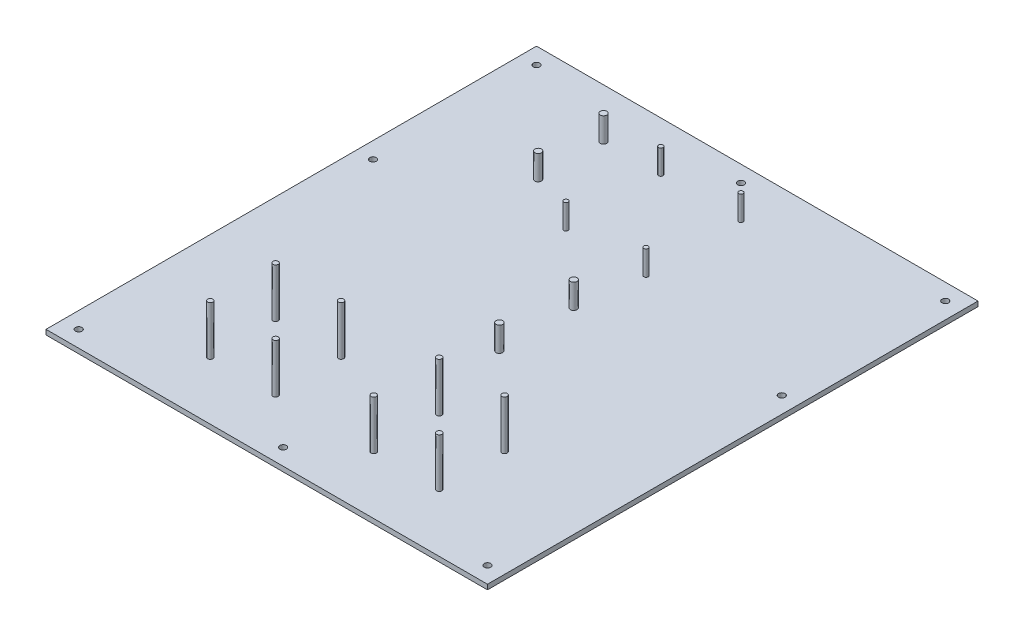
ISO-10303-21;
HEADER;
FILE_DESCRIPTION(('STEP AP214'),'2;1');
FILE_NAME('part.step','',(''),(''),'','','');
FILE_SCHEMA(('AUTOMOTIVE_DESIGN { 1 0 10303 214 1 1 1 1 }'));
ENDSEC;
DATA;
#1=APPLICATION_CONTEXT('core data for automotive mechanical design processes');
#2=APPLICATION_PROTOCOL_DEFINITION('international standard','automotive_design',2000,#1);
#3=PRODUCT_CONTEXT('',#1,'mechanical');
#4=PRODUCT('Part','Part','',(#3));
#5=PRODUCT_RELATED_PRODUCT_CATEGORY('part','',(#4));
#6=PRODUCT_DEFINITION_FORMATION('','',#4);
#7=PRODUCT_DEFINITION_CONTEXT('part definition',#1,'design');
#8=PRODUCT_DEFINITION('design','',#6,#7);
#9=PRODUCT_DEFINITION_SHAPE('','',#8);
#10=(LENGTH_UNIT() NAMED_UNIT(*) SI_UNIT(.MILLI.,.METRE.));
#11=(NAMED_UNIT(*) PLANE_ANGLE_UNIT() SI_UNIT($,.RADIAN.));
#12=(NAMED_UNIT(*) SI_UNIT($,.STERADIAN.) SOLID_ANGLE_UNIT());
#13=UNCERTAINTY_MEASURE_WITH_UNIT(LENGTH_MEASURE(1.E-05),#10,'distance_accuracy_value','');
#14=(GEOMETRIC_REPRESENTATION_CONTEXT(3) GLOBAL_UNCERTAINTY_ASSIGNED_CONTEXT((#13)) GLOBAL_UNIT_ASSIGNED_CONTEXT((#10,
#11,#12)) REPRESENTATION_CONTEXT('',''));
#15=CARTESIAN_POINT('',(0.,0.,0.));
#16=DIRECTION('',(0.,0.,1.));
#17=DIRECTION('',(1.,0.,0.));
#18=AXIS2_PLACEMENT_3D('',#15,#16,#17);
#19=CARTESIAN_POINT('',(0.,3.,0.));
#20=DIRECTION('',(0.,-1.,0.));
#21=DIRECTION('',(0.,0.,-1.));
#22=AXIS2_PLACEMENT_3D('',#19,#20,#21);
#23=PLANE('',#22);
#24=CARTESIAN_POINT('',(155.,3.,-212.));
#25=DIRECTION('',(0.,1.,0.));
#26=DIRECTION('',(0.,0.,1.));
#27=AXIS2_PLACEMENT_3D('',#24,#25,#26);
#28=CIRCLE('',#27,1.34999999999998);
#29=CARTESIAN_POINT('',(155.,3.,-210.65));
#30=VERTEX_POINT('',#29);
#31=EDGE_CURVE('E430',#30,#30,#28,.T.);
#32=ORIENTED_EDGE('',*,*,#31,.F.);
#33=EDGE_LOOP('',(#32));
#34=FACE_BOUND('',#33,.T.);
#35=CARTESIAN_POINT('',(106.,3.,-212.));
#36=DIRECTION('',(0.,1.,0.));
#37=DIRECTION('',(0.,0.,1.));
#38=AXIS2_PLACEMENT_3D('',#35,#36,#37);
#39=CIRCLE('',#38,1.35);
#40=CARTESIAN_POINT('',(106.,3.,-210.65));
#41=VERTEX_POINT('',#40);
#42=EDGE_CURVE('E422',#41,#41,#39,.T.);
#43=ORIENTED_EDGE('',*,*,#42,.F.);
#44=EDGE_LOOP('',(#43));
#45=FACE_BOUND('',#44,.T.);
#46=CARTESIAN_POINT('',(155.,3.,-270.));
#47=DIRECTION('',(0.,1.,0.));
#48=DIRECTION('',(0.,0.,1.));
#49=AXIS2_PLACEMENT_3D('',#46,#47,#48);
#50=CIRCLE('',#49,1.34999999999998);
#51=CARTESIAN_POINT('',(155.,3.,-268.65));
#52=VERTEX_POINT('',#51);
#53=EDGE_CURVE('E414',#52,#52,#50,.T.);
#54=ORIENTED_EDGE('',*,*,#53,.F.);
#55=EDGE_LOOP('',(#54));
#56=FACE_BOUND('',#55,.T.);
#57=CARTESIAN_POINT('',(106.,3.,-270.));
#58=DIRECTION('',(0.,1.,0.));
#59=DIRECTION('',(0.,0.,1.));
#60=AXIS2_PLACEMENT_3D('',#57,#58,#59);
#61=CIRCLE('',#60,1.35);
#62=CARTESIAN_POINT('',(106.,3.,-268.65));
#63=VERTEX_POINT('',#62);
#64=EDGE_CURVE('E409',#63,#63,#61,.T.);
#65=ORIENTED_EDGE('',*,*,#64,.F.);
#66=EDGE_LOOP('',(#65));
#67=FACE_BOUND('',#66,.T.);
#68=CARTESIAN_POINT('',(205.,3.,-35.462075723532));
#69=DIRECTION('',(0.,1.,0.));
#70=DIRECTION('',(0.,0.,1.));
#71=AXIS2_PLACEMENT_3D('',#68,#69,#70);
#72=CIRCLE('',#71,1.59999999999999);
#73=CARTESIAN_POINT('',(205.,3.,-33.8620757235321));
#74=VERTEX_POINT('',#73);
#75=EDGE_CURVE('E373',#74,#74,#72,.T.);
#76=ORIENTED_EDGE('',*,*,#75,.F.);
#77=EDGE_LOOP('',(#76));
#78=FACE_BOUND('',#77,.T.);
#79=CARTESIAN_POINT('',(205.,3.,-75.4620757235321));
#80=DIRECTION('',(0.,1.,0.));
#81=DIRECTION('',(0.,0.,1.));
#82=AXIS2_PLACEMENT_3D('',#79,#80,#81);
#83=CIRCLE('',#82,1.59999999999999);
#84=CARTESIAN_POINT('',(205.,3.,-73.8620757235321));
#85=VERTEX_POINT('',#84);
#86=EDGE_CURVE('E369',#85,#85,#83,.T.);
#87=ORIENTED_EDGE('',*,*,#86,.F.);
#88=EDGE_LOOP('',(#87));
#89=FACE_BOUND('',#88,.T.);
#90=CARTESIAN_POINT('',(71.,3.,-230.));
#91=DIRECTION('',(0.,-1.,0.));
#92=DIRECTION('',(0.,0.,-1.));
#93=AXIS2_PLACEMENT_3D('',#90,#91,#92);
#94=CIRCLE('',#93,2.);
#95=CARTESIAN_POINT('',(71.,3.,-232.));
#96=VERTEX_POINT('',#95);
#97=EDGE_CURVE('E11',#96,#96,#94,.F.);
#98=ORIENTED_EDGE('',*,*,#97,.F.);
#99=EDGE_LOOP('',(#98));
#100=FACE_BOUND('',#99,.T.);
#101=CARTESIAN_POINT('',(165.,3.,-75.4620757235321));
#102=DIRECTION('',(0.,-1.,0.));
#103=DIRECTION('',(0.,0.,-1.));
#104=AXIS2_PLACEMENT_3D('',#101,#102,#103);
#105=CIRCLE('',#104,1.59999999999999);
#106=CARTESIAN_POINT('',(165.,3.,-77.062075723532));
#107=VERTEX_POINT('',#106);
#108=EDGE_CURVE('E49',#107,#107,#105,.F.);
#109=ORIENTED_EDGE('',*,*,#108,.F.);
#110=EDGE_LOOP('',(#109));
#111=FACE_BOUND('',#110,.T.);
#112=CARTESIAN_POINT('',(105.,3.,-35.462075723532));
#113=DIRECTION('',(0.,-1.,0.));
#114=DIRECTION('',(0.,0.,-1.));
#115=AXIS2_PLACEMENT_3D('',#112,#113,#114);
#116=CIRCLE('',#115,1.60000000000001);
#117=CARTESIAN_POINT('',(105.,3.,-37.062075723532));
#118=VERTEX_POINT('',#117);
#119=EDGE_CURVE('E157',#118,#118,#116,.F.);
#120=ORIENTED_EDGE('',*,*,#119,.F.);
#121=EDGE_LOOP('',(#120));
#122=FACE_BOUND('',#121,.T.);
#123=CARTESIAN_POINT('',(65.,3.,-35.462075723532));
#124=DIRECTION('',(0.,-1.,0.));
#125=DIRECTION('',(0.,0.,-1.));
#126=AXIS2_PLACEMENT_3D('',#123,#124,#125);
#127=CIRCLE('',#126,1.60000000000001);
#128=CARTESIAN_POINT('',(65.,3.,-37.062075723532));
#129=VERTEX_POINT('',#128);
#130=EDGE_CURVE('E153',#129,#129,#127,.F.);
#131=ORIENTED_EDGE('',*,*,#130,.F.);
#132=EDGE_LOOP('',(#131));
#133=FACE_BOUND('',#132,.T.);
#134=CARTESIAN_POINT('',(105.,3.,-75.4620757235321));
#135=DIRECTION('',(0.,-1.,0.));
#136=DIRECTION('',(0.,0.,-1.));
#137=AXIS2_PLACEMENT_3D('',#134,#135,#136);
#138=CIRCLE('',#137,1.60000000000001);
#139=CARTESIAN_POINT('',(105.,3.,-77.0620757235321));
#140=VERTEX_POINT('',#139);
#141=EDGE_CURVE('E149',#140,#140,#138,.F.);
#142=ORIENTED_EDGE('',*,*,#141,.F.);
#143=EDGE_LOOP('',(#142));
#144=FACE_BOUND('',#143,.T.);
#145=CARTESIAN_POINT('',(65.,3.,-75.4620757235321));
#146=DIRECTION('',(0.,-1.,0.));
#147=DIRECTION('',(0.,0.,-1.));
#148=AXIS2_PLACEMENT_3D('',#145,#146,#147);
#149=CIRCLE('',#148,1.60000000000001);
#150=CARTESIAN_POINT('',(65.,3.,-77.0620757235321));
#151=VERTEX_POINT('',#150);
#152=EDGE_CURVE('E145',#151,#151,#149,.F.);
#153=ORIENTED_EDGE('',*,*,#152,.F.);
#154=EDGE_LOOP('',(#153));
#155=FACE_BOUND('',#154,.T.);
#156=CARTESIAN_POINT('',(165.,3.,-35.462075723532));
#157=DIRECTION('',(0.,-1.,0.));
#158=DIRECTION('',(0.,0.,-1.));
#159=AXIS2_PLACEMENT_3D('',#156,#157,#158);
#160=CIRCLE('',#159,1.59999999999999);
#161=CARTESIAN_POINT('',(165.,3.,-37.062075723532));
#162=VERTEX_POINT('',#161);
#163=EDGE_CURVE('E141',#162,#162,#160,.F.);
#164=ORIENTED_EDGE('',*,*,#163,.F.);
#165=EDGE_LOOP('',(#164));
#166=FACE_BOUND('',#165,.T.);
#167=CARTESIAN_POINT('',(71.,3.,-270.));
#168=DIRECTION('',(0.,-1.,0.));
#169=DIRECTION('',(0.,0.,-1.));
#170=AXIS2_PLACEMENT_3D('',#167,#168,#169);
#171=CIRCLE('',#170,2.);
#172=CARTESIAN_POINT('',(71.,3.,-272.));
#173=VERTEX_POINT('',#172);
#174=EDGE_CURVE('E137',#173,#173,#171,.F.);
#175=ORIENTED_EDGE('',*,*,#174,.F.);
#176=EDGE_LOOP('',(#175));
#177=FACE_BOUND('',#176,.T.);
#178=CARTESIAN_POINT('',(150.,3.,-127.25));
#179=DIRECTION('',(0.,-1.,0.));
#180=DIRECTION('',(0.,0.,-1.));
#181=AXIS2_PLACEMENT_3D('',#178,#179,#180);
#182=CIRCLE('',#181,2.);
#183=CARTESIAN_POINT('',(150.,3.,-129.25));
#184=VERTEX_POINT('',#183);
#185=EDGE_CURVE('E133',#184,#184,#182,.F.);
#186=ORIENTED_EDGE('',*,*,#185,.F.);
#187=EDGE_LOOP('',(#186));
#188=FACE_BOUND('',#187,.T.);
#189=CARTESIAN_POINT('',(150.,3.,-172.75));
#190=DIRECTION('',(0.,-1.,0.));
#191=DIRECTION('',(0.,0.,-1.));
#192=AXIS2_PLACEMENT_3D('',#189,#190,#191);
#193=CIRCLE('',#192,2.);
#194=CARTESIAN_POINT('',(150.,3.,-174.75));
#195=VERTEX_POINT('',#194);
#196=EDGE_CURVE('E129',#195,#195,#193,.F.);
#197=ORIENTED_EDGE('',*,*,#196,.F.);
#198=EDGE_LOOP('',(#197));
#199=FACE_BOUND('',#198,.T.);
#200=DIRECTION('',(0.,0.,1.));
#201=VECTOR('',#200,1.);
#202=CARTESIAN_POINT('',(0.,3.,0.));
#203=LINE('',#202,#201);
#204=CARTESIAN_POINT('',(0.,3.,-300.));
#205=VERTEX_POINT('',#204);
#206=CARTESIAN_POINT('',(0.,3.,0.));
#207=VERTEX_POINT('',#206);
#208=EDGE_CURVE('E93',#205,#207,#203,.T.);
#209=ORIENTED_EDGE('',*,*,#208,.T.);
#210=DIRECTION('',(1.,0.,0.));
#211=VECTOR('',#210,1.);
#212=CARTESIAN_POINT('',(0.,3.,0.));
#213=LINE('',#212,#211);
#214=CARTESIAN_POINT('',(270.,3.,0.));
#215=VERTEX_POINT('',#214);
#216=EDGE_CURVE('E88',#207,#215,#213,.T.);
#217=ORIENTED_EDGE('',*,*,#216,.T.);
#218=DIRECTION('',(0.,0.,-1.));
#219=VECTOR('',#218,1.);
#220=CARTESIAN_POINT('',(270.,3.,0.));
#221=LINE('',#220,#219);
#222=CARTESIAN_POINT('',(270.,3.,-300.));
#223=VERTEX_POINT('',#222);
#224=EDGE_CURVE('E91',#215,#223,#221,.T.);
#225=ORIENTED_EDGE('',*,*,#224,.T.);
#226=DIRECTION('',(-1.,0.,0.));
#227=VECTOR('',#226,1.);
#228=CARTESIAN_POINT('',(0.,3.,-300.));
#229=LINE('',#228,#227);
#230=EDGE_CURVE('E57',#223,#205,#229,.T.);
#231=ORIENTED_EDGE('',*,*,#230,.T.);
#232=EDGE_LOOP('',(#209,#217,#225,#231));
#233=FACE_BOUND('',#232,.T.);
#234=CARTESIAN_POINT('',(135.,3.,-10.));
#235=DIRECTION('',(0.,1.,0.));
#236=DIRECTION('',(0.,0.,1.));
#237=AXIS2_PLACEMENT_3D('',#234,#235,#236);
#238=CIRCLE('',#237,2.);
#239=CARTESIAN_POINT('',(135.,3.,-8.));
#240=VERTEX_POINT('',#239);
#241=EDGE_CURVE('E116',#240,#240,#238,.T.);
#242=ORIENTED_EDGE('',*,*,#241,.F.);
#243=EDGE_LOOP('',(#242));
#244=FACE_BOUND('',#243,.T.);
#245=CARTESIAN_POINT('',(10.,3.,-290.));
#246=DIRECTION('',(0.,1.,0.));
#247=DIRECTION('',(0.,0.,1.));
#248=AXIS2_PLACEMENT_3D('',#245,#246,#247);
#249=CIRCLE('',#248,2.);
#250=CARTESIAN_POINT('',(10.,3.,-288.));
#251=VERTEX_POINT('',#250);
#252=EDGE_CURVE('E315',#251,#251,#249,.T.);
#253=ORIENTED_EDGE('',*,*,#252,.F.);
#254=EDGE_LOOP('',(#253));
#255=FACE_BOUND('',#254,.T.);
#256=CARTESIAN_POINT('',(10.,3.,-190.));
#257=DIRECTION('',(0.,1.,0.));
#258=DIRECTION('',(0.,0.,1.));
#259=AXIS2_PLACEMENT_3D('',#256,#257,#258);
#260=CIRCLE('',#259,2.);
#261=CARTESIAN_POINT('',(10.,3.,-188.));
#262=VERTEX_POINT('',#261);
#263=EDGE_CURVE('E308',#262,#262,#260,.T.);
#264=ORIENTED_EDGE('',*,*,#263,.F.);
#265=EDGE_LOOP('',(#264));
#266=FACE_BOUND('',#265,.T.);
#267=CARTESIAN_POINT('',(10.,3.,-9.99999999999998));
#268=DIRECTION('',(0.,1.,0.));
#269=DIRECTION('',(0.,0.,1.));
#270=AXIS2_PLACEMENT_3D('',#267,#268,#269);
#271=CIRCLE('',#270,2.);
#272=CARTESIAN_POINT('',(10.,3.,-7.99999999999998));
#273=VERTEX_POINT('',#272);
#274=EDGE_CURVE('E301',#273,#273,#271,.T.);
#275=ORIENTED_EDGE('',*,*,#274,.F.);
#276=EDGE_LOOP('',(#275));
#277=FACE_BOUND('',#276,.T.);
#278=CARTESIAN_POINT('',(260.,3.,-290.));
#279=DIRECTION('',(0.,1.,0.));
#280=DIRECTION('',(0.,0.,-1.));
#281=AXIS2_PLACEMENT_3D('',#278,#279,#280);
#282=CIRCLE('',#281,2.);
#283=CARTESIAN_POINT('',(260.,3.,-292.));
#284=VERTEX_POINT('',#283);
#285=EDGE_CURVE('E294',#284,#284,#282,.T.);
#286=ORIENTED_EDGE('',*,*,#285,.F.);
#287=EDGE_LOOP('',(#286));
#288=FACE_BOUND('',#287,.T.);
#289=CARTESIAN_POINT('',(260.,3.,-190.));
#290=DIRECTION('',(0.,1.,0.));
#291=DIRECTION('',(0.,0.,-1.));
#292=AXIS2_PLACEMENT_3D('',#289,#290,#291);
#293=CIRCLE('',#292,2.);
#294=CARTESIAN_POINT('',(260.,3.,-192.));
#295=VERTEX_POINT('',#294);
#296=EDGE_CURVE('E287',#295,#295,#293,.T.);
#297=ORIENTED_EDGE('',*,*,#296,.F.);
#298=EDGE_LOOP('',(#297));
#299=FACE_BOUND('',#298,.T.);
#300=CARTESIAN_POINT('',(260.,3.,-9.99999999999998));
#301=DIRECTION('',(0.,1.,0.));
#302=DIRECTION('',(0.,0.,-1.));
#303=AXIS2_PLACEMENT_3D('',#300,#301,#302);
#304=CIRCLE('',#303,2.);
#305=CARTESIAN_POINT('',(260.,3.,-12.));
#306=VERTEX_POINT('',#305);
#307=EDGE_CURVE('E280',#306,#306,#304,.T.);
#308=ORIENTED_EDGE('',*,*,#307,.F.);
#309=EDGE_LOOP('',(#308));
#310=FACE_BOUND('',#309,.T.);
#311=CARTESIAN_POINT('',(135.,3.,-290.));
#312=DIRECTION('',(0.,1.,0.));
#313=DIRECTION('',(0.,0.,1.));
#314=AXIS2_PLACEMENT_3D('',#311,#312,#313);
#315=CIRCLE('',#314,2.);
#316=CARTESIAN_POINT('',(135.,3.,-288.));
#317=VERTEX_POINT('',#316);
#318=EDGE_CURVE('E268',#317,#317,#315,.T.);
#319=ORIENTED_EDGE('',*,*,#318,.F.);
#320=EDGE_LOOP('',(#319));
#321=FACE_BOUND('',#320,.T.);
#322=ADVANCED_FACE('F39',(#34,#45,#56,#67,#78,#89,#100,#111,#122,#133,#144,#155,#166,#177,#188,
#199,#233,#244,#255,#266,#277,#288,#299,#310,#321),#23,.F.);
#323=CARTESIAN_POINT('',(0.,0.,0.));
#324=DIRECTION('',(0.,-1.,0.));
#325=DIRECTION('',(0.,0.,-1.));
#326=AXIS2_PLACEMENT_3D('',#323,#324,#325);
#327=PLANE('',#326);
#328=CARTESIAN_POINT('',(260.,0.,-9.99999999999998));
#329=DIRECTION('',(0.,1.,0.));
#330=DIRECTION('',(0.,0.,-1.));
#331=AXIS2_PLACEMENT_3D('',#328,#329,#330);
#332=CIRCLE('',#331,2.);
#333=CARTESIAN_POINT('',(260.,0.,-12.));
#334=VERTEX_POINT('',#333);
#335=EDGE_CURVE('E274',#334,#334,#332,.T.);
#336=ORIENTED_EDGE('',*,*,#335,.T.);
#337=EDGE_LOOP('',(#336));
#338=FACE_BOUND('',#337,.T.);
#339=CARTESIAN_POINT('',(260.,0.,-290.));
#340=DIRECTION('',(0.,1.,0.));
#341=DIRECTION('',(0.,0.,-1.));
#342=AXIS2_PLACEMENT_3D('',#339,#340,#341);
#343=CIRCLE('',#342,2.);
#344=CARTESIAN_POINT('',(260.,0.,-292.));
#345=VERTEX_POINT('',#344);
#346=EDGE_CURVE('E291',#345,#345,#343,.T.);
#347=ORIENTED_EDGE('',*,*,#346,.T.);
#348=EDGE_LOOP('',(#347));
#349=FACE_BOUND('',#348,.T.);
#350=CARTESIAN_POINT('',(10.,0.,-190.));
#351=DIRECTION('',(0.,1.,0.));
#352=DIRECTION('',(0.,0.,1.));
#353=AXIS2_PLACEMENT_3D('',#350,#351,#352);
#354=CIRCLE('',#353,2.);
#355=CARTESIAN_POINT('',(10.,0.,-188.));
#356=VERTEX_POINT('',#355);
#357=EDGE_CURVE('E305',#356,#356,#354,.T.);
#358=ORIENTED_EDGE('',*,*,#357,.T.);
#359=EDGE_LOOP('',(#358));
#360=FACE_BOUND('',#359,.T.);
#361=CARTESIAN_POINT('',(135.,0.,-10.));
#362=DIRECTION('',(0.,1.,0.));
#363=DIRECTION('',(0.,0.,1.));
#364=AXIS2_PLACEMENT_3D('',#361,#362,#363);
#365=CIRCLE('',#364,2.);
#366=CARTESIAN_POINT('',(135.,0.,-8.));
#367=VERTEX_POINT('',#366);
#368=EDGE_CURVE('E319',#367,#367,#365,.T.);
#369=ORIENTED_EDGE('',*,*,#368,.T.);
#370=EDGE_LOOP('',(#369));
#371=FACE_BOUND('',#370,.T.);
#372=DIRECTION('',(0.,0.,1.));
#373=VECTOR('',#372,1.);
#374=CARTESIAN_POINT('',(0.,0.,0.));
#375=LINE('',#374,#373);
#376=CARTESIAN_POINT('',(0.,0.,-300.));
#377=VERTEX_POINT('',#376);
#378=CARTESIAN_POINT('',(0.,0.,0.));
#379=VERTEX_POINT('',#378);
#380=EDGE_CURVE('E112',#377,#379,#375,.T.);
#381=ORIENTED_EDGE('',*,*,#380,.F.);
#382=DIRECTION('',(-1.,0.,0.));
#383=VECTOR('',#382,1.);
#384=CARTESIAN_POINT('',(0.,0.,-300.));
#385=LINE('',#384,#383);
#386=CARTESIAN_POINT('',(270.,0.,-300.));
#387=VERTEX_POINT('',#386);
#388=EDGE_CURVE('E80',#387,#377,#385,.T.);
#389=ORIENTED_EDGE('',*,*,#388,.F.);
#390=DIRECTION('',(0.,0.,-1.));
#391=VECTOR('',#390,1.);
#392=CARTESIAN_POINT('',(270.,0.,0.));
#393=LINE('',#392,#391);
#394=CARTESIAN_POINT('',(270.,0.,0.));
#395=VERTEX_POINT('',#394);
#396=EDGE_CURVE('E74',#395,#387,#393,.T.);
#397=ORIENTED_EDGE('',*,*,#396,.F.);
#398=DIRECTION('',(1.,0.,0.));
#399=VECTOR('',#398,1.);
#400=CARTESIAN_POINT('',(0.,0.,0.));
#401=LINE('',#400,#399);
#402=EDGE_CURVE('E99',#379,#395,#401,.T.);
#403=ORIENTED_EDGE('',*,*,#402,.F.);
#404=EDGE_LOOP('',(#381,#389,#397,#403));
#405=FACE_BOUND('',#404,.T.);
#406=CARTESIAN_POINT('',(10.,0.,-290.));
#407=DIRECTION('',(0.,1.,0.));
#408=DIRECTION('',(0.,0.,1.));
#409=AXIS2_PLACEMENT_3D('',#406,#407,#408);
#410=CIRCLE('',#409,2.);
#411=CARTESIAN_POINT('',(10.,0.,-288.));
#412=VERTEX_POINT('',#411);
#413=EDGE_CURVE('E254',#412,#412,#410,.T.);
#414=ORIENTED_EDGE('',*,*,#413,.T.);
#415=EDGE_LOOP('',(#414));
#416=FACE_BOUND('',#415,.T.);
#417=CARTESIAN_POINT('',(10.,0.,-9.99999999999998));
#418=DIRECTION('',(0.,1.,0.));
#419=DIRECTION('',(0.,0.,1.));
#420=AXIS2_PLACEMENT_3D('',#417,#418,#419);
#421=CIRCLE('',#420,2.);
#422=CARTESIAN_POINT('',(10.,0.,-7.99999999999998));
#423=VERTEX_POINT('',#422);
#424=EDGE_CURVE('E258',#423,#423,#421,.T.);
#425=ORIENTED_EDGE('',*,*,#424,.T.);
#426=EDGE_LOOP('',(#425));
#427=FACE_BOUND('',#426,.T.);
#428=CARTESIAN_POINT('',(260.,0.,-190.));
#429=DIRECTION('',(0.,1.,0.));
#430=DIRECTION('',(0.,0.,-1.));
#431=AXIS2_PLACEMENT_3D('',#428,#429,#430);
#432=CIRCLE('',#431,2.);
#433=CARTESIAN_POINT('',(260.,0.,-192.));
#434=VERTEX_POINT('',#433);
#435=EDGE_CURVE('E262',#434,#434,#432,.T.);
#436=ORIENTED_EDGE('',*,*,#435,.T.);
#437=EDGE_LOOP('',(#436));
#438=FACE_BOUND('',#437,.T.);
#439=CARTESIAN_POINT('',(135.,0.,-290.));
#440=DIRECTION('',(0.,1.,0.));
#441=DIRECTION('',(0.,0.,1.));
#442=AXIS2_PLACEMENT_3D('',#439,#440,#441);
#443=CIRCLE('',#442,2.);
#444=CARTESIAN_POINT('',(135.,0.,-288.));
#445=VERTEX_POINT('',#444);
#446=EDGE_CURVE('E265',#445,#445,#443,.T.);
#447=ORIENTED_EDGE('',*,*,#446,.T.);
#448=EDGE_LOOP('',(#447));
#449=FACE_BOUND('',#448,.T.);
#450=ADVANCED_FACE('F169',(#338,#349,#360,#371,#405,#416,#427,#438,#449),#327,.T.);
#451=CARTESIAN_POINT('',(0.,3.,0.));
#452=DIRECTION('',(1.,0.,0.));
#453=DIRECTION('',(0.,0.,-1.));
#454=AXIS2_PLACEMENT_3D('',#451,#452,#453);
#455=PLANE('',#454);
#456=ORIENTED_EDGE('',*,*,#380,.T.);
#457=DIRECTION('',(0.,-1.,0.));
#458=VECTOR('',#457,1.);
#459=CARTESIAN_POINT('',(0.,3.,0.));
#460=LINE('',#459,#458);
#461=EDGE_CURVE('E101',#207,#379,#460,.T.);
#462=ORIENTED_EDGE('',*,*,#461,.F.);
#463=ORIENTED_EDGE('',*,*,#208,.F.);
#464=DIRECTION('',(0.,-1.,0.));
#465=VECTOR('',#464,1.);
#466=CARTESIAN_POINT('',(0.,3.,-300.));
#467=LINE('',#466,#465);
#468=EDGE_CURVE('E108',#205,#377,#467,.T.);
#469=ORIENTED_EDGE('',*,*,#468,.T.);
#470=EDGE_LOOP('',(#456,#462,#463,#469));
#471=FACE_BOUND('',#470,.T.);
#472=ADVANCED_FACE('F41',(#471),#455,.F.);
#473=CARTESIAN_POINT('',(0.,3.,0.));
#474=DIRECTION('',(0.,0.,-1.));
#475=DIRECTION('',(-1.,0.,0.));
#476=AXIS2_PLACEMENT_3D('',#473,#474,#475);
#477=PLANE('',#476);
#478=ORIENTED_EDGE('',*,*,#402,.T.);
#479=DIRECTION('',(0.,-1.,0.));
#480=VECTOR('',#479,1.);
#481=CARTESIAN_POINT('',(270.,3.,0.));
#482=LINE('',#481,#480);
#483=EDGE_CURVE('E97',#215,#395,#482,.T.);
#484=ORIENTED_EDGE('',*,*,#483,.F.);
#485=ORIENTED_EDGE('',*,*,#216,.F.);
#486=ORIENTED_EDGE('',*,*,#461,.T.);
#487=EDGE_LOOP('',(#478,#484,#485,#486));
#488=FACE_BOUND('',#487,.T.);
#489=ADVANCED_FACE('F98',(#488),#477,.F.);
#490=CARTESIAN_POINT('',(270.,3.,0.));
#491=DIRECTION('',(-1.,0.,0.));
#492=DIRECTION('',(0.,0.,1.));
#493=AXIS2_PLACEMENT_3D('',#490,#491,#492);
#494=PLANE('',#493);
#495=ORIENTED_EDGE('',*,*,#396,.T.);
#496=DIRECTION('',(0.,-1.,0.));
#497=VECTOR('',#496,1.);
#498=CARTESIAN_POINT('',(270.,3.,-300.));
#499=LINE('',#498,#497);
#500=EDGE_CURVE('E102',#223,#387,#499,.T.);
#501=ORIENTED_EDGE('',*,*,#500,.F.);
#502=ORIENTED_EDGE('',*,*,#224,.F.);
#503=ORIENTED_EDGE('',*,*,#483,.T.);
#504=EDGE_LOOP('',(#495,#501,#502,#503));
#505=FACE_BOUND('',#504,.T.);
#506=ADVANCED_FACE('F104',(#505),#494,.F.);
#507=CARTESIAN_POINT('',(0.,3.,-300.));
#508=DIRECTION('',(0.,0.,1.));
#509=DIRECTION('',(1.,0.,0.));
#510=AXIS2_PLACEMENT_3D('',#507,#508,#509);
#511=PLANE('',#510);
#512=ORIENTED_EDGE('',*,*,#388,.T.);
#513=ORIENTED_EDGE('',*,*,#468,.F.);
#514=ORIENTED_EDGE('',*,*,#230,.F.);
#515=ORIENTED_EDGE('',*,*,#500,.T.);
#516=EDGE_LOOP('',(#512,#513,#514,#515));
#517=FACE_BOUND('',#516,.T.);
#518=ADVANCED_FACE('F232',(#517),#511,.F.);
#519=CARTESIAN_POINT('',(135.,3.,-10.));
#520=DIRECTION('',(0.,-1.,0.));
#521=DIRECTION('',(0.,0.,-1.));
#522=AXIS2_PLACEMENT_3D('',#519,#520,#521);
#523=CYLINDRICAL_SURFACE('',#522,2.);
#524=ORIENTED_EDGE('',*,*,#241,.T.);
#525=EDGE_LOOP('',(#524));
#526=FACE_BOUND('',#525,.T.);
#527=ORIENTED_EDGE('',*,*,#368,.F.);
#528=EDGE_LOOP('',(#527));
#529=FACE_BOUND('',#528,.T.);
#530=ADVANCED_FACE('F229',(#526,#529),#523,.F.);
#531=CARTESIAN_POINT('',(10.,3.,-290.));
#532=DIRECTION('',(0.,-1.,0.));
#533=DIRECTION('',(0.,0.,-1.));
#534=AXIS2_PLACEMENT_3D('',#531,#532,#533);
#535=CYLINDRICAL_SURFACE('',#534,2.);
#536=ORIENTED_EDGE('',*,*,#252,.T.);
#537=EDGE_LOOP('',(#536));
#538=FACE_BOUND('',#537,.T.);
#539=ORIENTED_EDGE('',*,*,#413,.F.);
#540=EDGE_LOOP('',(#539));
#541=FACE_BOUND('',#540,.T.);
#542=ADVANCED_FACE('F225',(#538,#541),#535,.F.);
#543=CARTESIAN_POINT('',(10.,3.,-190.));
#544=DIRECTION('',(0.,-1.,0.));
#545=DIRECTION('',(0.,0.,-1.));
#546=AXIS2_PLACEMENT_3D('',#543,#544,#545);
#547=CYLINDRICAL_SURFACE('',#546,2.);
#548=ORIENTED_EDGE('',*,*,#263,.T.);
#549=EDGE_LOOP('',(#548));
#550=FACE_BOUND('',#549,.T.);
#551=ORIENTED_EDGE('',*,*,#357,.F.);
#552=EDGE_LOOP('',(#551));
#553=FACE_BOUND('',#552,.T.);
#554=ADVANCED_FACE('F221',(#550,#553),#547,.F.);
#555=CARTESIAN_POINT('',(10.,3.,-9.99999999999998));
#556=DIRECTION('',(0.,-1.,0.));
#557=DIRECTION('',(0.,0.,-1.));
#558=AXIS2_PLACEMENT_3D('',#555,#556,#557);
#559=CYLINDRICAL_SURFACE('',#558,2.);
#560=ORIENTED_EDGE('',*,*,#274,.T.);
#561=EDGE_LOOP('',(#560));
#562=FACE_BOUND('',#561,.T.);
#563=ORIENTED_EDGE('',*,*,#424,.F.);
#564=EDGE_LOOP('',(#563));
#565=FACE_BOUND('',#564,.T.);
#566=ADVANCED_FACE('F217',(#562,#565),#559,.F.);
#567=CARTESIAN_POINT('',(260.,3.,-290.));
#568=DIRECTION('',(0.,-1.,0.));
#569=DIRECTION('',(0.,0.,-1.));
#570=AXIS2_PLACEMENT_3D('',#567,#568,#569);
#571=CYLINDRICAL_SURFACE('',#570,2.);
#572=ORIENTED_EDGE('',*,*,#285,.T.);
#573=EDGE_LOOP('',(#572));
#574=FACE_BOUND('',#573,.T.);
#575=ORIENTED_EDGE('',*,*,#346,.F.);
#576=EDGE_LOOP('',(#575));
#577=FACE_BOUND('',#576,.T.);
#578=ADVANCED_FACE('F213',(#574,#577),#571,.F.);
#579=CARTESIAN_POINT('',(260.,3.,-190.));
#580=DIRECTION('',(0.,-1.,0.));
#581=DIRECTION('',(0.,0.,-1.));
#582=AXIS2_PLACEMENT_3D('',#579,#580,#581);
#583=CYLINDRICAL_SURFACE('',#582,2.);
#584=ORIENTED_EDGE('',*,*,#296,.T.);
#585=EDGE_LOOP('',(#584));
#586=FACE_BOUND('',#585,.T.);
#587=ORIENTED_EDGE('',*,*,#435,.F.);
#588=EDGE_LOOP('',(#587));
#589=FACE_BOUND('',#588,.T.);
#590=ADVANCED_FACE('F209',(#586,#589),#583,.F.);
#591=CARTESIAN_POINT('',(260.,3.,-9.99999999999998));
#592=DIRECTION('',(0.,-1.,0.));
#593=DIRECTION('',(0.,0.,-1.));
#594=AXIS2_PLACEMENT_3D('',#591,#592,#593);
#595=CYLINDRICAL_SURFACE('',#594,2.);
#596=ORIENTED_EDGE('',*,*,#307,.T.);
#597=EDGE_LOOP('',(#596));
#598=FACE_BOUND('',#597,.T.);
#599=ORIENTED_EDGE('',*,*,#335,.F.);
#600=EDGE_LOOP('',(#599));
#601=FACE_BOUND('',#600,.T.);
#602=ADVANCED_FACE('F201',(#598,#601),#595,.F.);
#603=CARTESIAN_POINT('',(135.,3.,-290.));
#604=DIRECTION('',(0.,-1.,0.));
#605=DIRECTION('',(0.,0.,-1.));
#606=AXIS2_PLACEMENT_3D('',#603,#604,#605);
#607=CYLINDRICAL_SURFACE('',#606,2.);
#608=ORIENTED_EDGE('',*,*,#318,.T.);
#609=EDGE_LOOP('',(#608));
#610=FACE_BOUND('',#609,.T.);
#611=ORIENTED_EDGE('',*,*,#446,.F.);
#612=EDGE_LOOP('',(#611));
#613=FACE_BOUND('',#612,.T.);
#614=ADVANCED_FACE('F191',(#610,#613),#607,.F.);
#615=CARTESIAN_POINT('',(150.,18.,-172.75));
#616=DIRECTION('',(0.,-1.,0.));
#617=DIRECTION('',(0.,0.,-1.));
#618=AXIS2_PLACEMENT_3D('',#615,#616,#617);
#619=CYLINDRICAL_SURFACE('',#618,2.);
#620=CARTESIAN_POINT('',(150.,18.,-172.75));
#621=DIRECTION('',(0.,1.,0.));
#622=DIRECTION('',(0.,0.,1.));
#623=AXIS2_PLACEMENT_3D('',#620,#621,#622);
#624=CIRCLE('',#623,2.);
#625=CARTESIAN_POINT('',(150.,18.,-170.75));
#626=VERTEX_POINT('',#625);
#627=EDGE_CURVE('E269',#626,#626,#624,.T.);
#628=ORIENTED_EDGE('',*,*,#627,.F.);
#629=EDGE_LOOP('',(#628));
#630=FACE_BOUND('',#629,.T.);
#631=ORIENTED_EDGE('',*,*,#196,.T.);
#632=EDGE_LOOP('',(#631));
#633=FACE_BOUND('',#632,.T.);
#634=ADVANCED_FACE('F188',(#630,#633),#619,.T.);
#635=CARTESIAN_POINT('',(150.,18.,-172.75));
#636=DIRECTION('',(0.,1.,0.));
#637=DIRECTION('',(0.,0.,1.));
#638=AXIS2_PLACEMENT_3D('',#635,#636,#637);
#639=PLANE('',#638);
#640=ORIENTED_EDGE('',*,*,#627,.T.);
#641=EDGE_LOOP('',(#640));
#642=FACE_BOUND('',#641,.T.);
#643=ADVANCED_FACE('F190',(#642),#639,.T.);
#644=CARTESIAN_POINT('',(150.,18.,-127.25));
#645=DIRECTION('',(0.,-1.,0.));
#646=DIRECTION('',(0.,0.,-1.));
#647=AXIS2_PLACEMENT_3D('',#644,#645,#646);
#648=CYLINDRICAL_SURFACE('',#647,2.);
#649=CARTESIAN_POINT('',(150.,18.,-127.25));
#650=DIRECTION('',(0.,1.,0.));
#651=DIRECTION('',(0.,0.,-1.));
#652=AXIS2_PLACEMENT_3D('',#649,#650,#651);
#653=CIRCLE('',#652,2.);
#654=CARTESIAN_POINT('',(150.,18.,-129.25));
#655=VERTEX_POINT('',#654);
#656=EDGE_CURVE('E277',#655,#655,#653,.T.);
#657=ORIENTED_EDGE('',*,*,#656,.F.);
#658=EDGE_LOOP('',(#657));
#659=FACE_BOUND('',#658,.T.);
#660=ORIENTED_EDGE('',*,*,#185,.T.);
#661=EDGE_LOOP('',(#660));
#662=FACE_BOUND('',#661,.T.);
#663=ADVANCED_FACE('F198',(#659,#662),#648,.T.);
#664=CARTESIAN_POINT('',(150.,18.,-127.25));
#665=DIRECTION('',(0.,-1.,0.));
#666=DIRECTION('',(0.,0.,-1.));
#667=AXIS2_PLACEMENT_3D('',#664,#665,#666);
#668=PLANE('',#667);
#669=ORIENTED_EDGE('',*,*,#656,.T.);
#670=EDGE_LOOP('',(#669));
#671=FACE_BOUND('',#670,.T.);
#672=ADVANCED_FACE('F500',(#671),#668,.F.);
#673=CARTESIAN_POINT('',(71.,18.,-270.));
#674=DIRECTION('',(0.,-1.,0.));
#675=DIRECTION('',(0.,0.,-1.));
#676=AXIS2_PLACEMENT_3D('',#673,#674,#675);
#677=CYLINDRICAL_SURFACE('',#676,2.);
#678=CARTESIAN_POINT('',(71.,18.,-270.));
#679=DIRECTION('',(0.,1.,0.));
#680=DIRECTION('',(0.,0.,-1.));
#681=AXIS2_PLACEMENT_3D('',#678,#679,#680);
#682=CIRCLE('',#681,2.);
#683=CARTESIAN_POINT('',(71.,18.,-272.));
#684=VERTEX_POINT('',#683);
#685=EDGE_CURVE('E361',#684,#684,#682,.T.);
#686=ORIENTED_EDGE('',*,*,#685,.F.);
#687=EDGE_LOOP('',(#686));
#688=FACE_BOUND('',#687,.T.);
#689=ORIENTED_EDGE('',*,*,#174,.T.);
#690=EDGE_LOOP('',(#689));
#691=FACE_BOUND('',#690,.T.);
#692=ADVANCED_FACE('F496',(#688,#691),#677,.T.);
#693=CARTESIAN_POINT('',(71.,18.,-270.));
#694=DIRECTION('',(0.,-1.,0.));
#695=DIRECTION('',(0.,0.,-1.));
#696=AXIS2_PLACEMENT_3D('',#693,#694,#695);
#697=PLANE('',#696);
#698=ORIENTED_EDGE('',*,*,#685,.T.);
#699=EDGE_LOOP('',(#698));
#700=FACE_BOUND('',#699,.T.);
#701=ADVANCED_FACE('F492',(#700),#697,.F.);
#702=CARTESIAN_POINT('',(165.,18.,-35.462075723532));
#703=DIRECTION('',(0.,-1.,0.));
#704=DIRECTION('',(0.,0.,-1.));
#705=AXIS2_PLACEMENT_3D('',#702,#703,#704);
#706=CYLINDRICAL_SURFACE('',#705,1.59999999999999);
#707=ORIENTED_EDGE('',*,*,#163,.T.);
#708=EDGE_LOOP('',(#707));
#709=FACE_BOUND('',#708,.T.);
#710=CARTESIAN_POINT('',(165.,33.,-35.462075723532));
#711=DIRECTION('',(0.,1.,0.));
#712=DIRECTION('',(0.,0.,1.));
#713=AXIS2_PLACEMENT_3D('',#710,#711,#712);
#714=CIRCLE('',#713,1.59999999999999);
#715=CARTESIAN_POINT('',(165.,33.,-33.8620757235321));
#716=VERTEX_POINT('',#715);
#717=EDGE_CURVE('E397',#716,#716,#714,.T.);
#718=ORIENTED_EDGE('',*,*,#717,.F.);
#719=EDGE_LOOP('',(#718));
#720=FACE_BOUND('',#719,.T.);
#721=ADVANCED_FACE('F488',(#709,#720),#706,.T.);
#722=CARTESIAN_POINT('',(65.,18.,-75.4620757235321));
#723=DIRECTION('',(0.,-1.,0.));
#724=DIRECTION('',(0.,0.,-1.));
#725=AXIS2_PLACEMENT_3D('',#722,#723,#724);
#726=CYLINDRICAL_SURFACE('',#725,1.60000000000001);
#727=ORIENTED_EDGE('',*,*,#152,.T.);
#728=EDGE_LOOP('',(#727));
#729=FACE_BOUND('',#728,.T.);
#730=CARTESIAN_POINT('',(65.,33.,-75.4620757235321));
#731=DIRECTION('',(0.,1.,0.));
#732=DIRECTION('',(0.,0.,1.));
#733=AXIS2_PLACEMENT_3D('',#730,#731,#732);
#734=CIRCLE('',#733,1.60000000000001);
#735=CARTESIAN_POINT('',(65.,33.,-73.8620757235321));
#736=VERTEX_POINT('',#735);
#737=EDGE_CURVE('E389',#736,#736,#734,.T.);
#738=ORIENTED_EDGE('',*,*,#737,.F.);
#739=EDGE_LOOP('',(#738));
#740=FACE_BOUND('',#739,.T.);
#741=ADVANCED_FACE('F484',(#729,#740),#726,.T.);
#742=CARTESIAN_POINT('',(105.,18.,-75.4620757235321));
#743=DIRECTION('',(0.,-1.,0.));
#744=DIRECTION('',(0.,0.,-1.));
#745=AXIS2_PLACEMENT_3D('',#742,#743,#744);
#746=CYLINDRICAL_SURFACE('',#745,1.60000000000001);
#747=ORIENTED_EDGE('',*,*,#141,.T.);
#748=EDGE_LOOP('',(#747));
#749=FACE_BOUND('',#748,.T.);
#750=CARTESIAN_POINT('',(105.,33.,-75.4620757235321));
#751=DIRECTION('',(0.,1.,0.));
#752=DIRECTION('',(0.,0.,1.));
#753=AXIS2_PLACEMENT_3D('',#750,#751,#752);
#754=CIRCLE('',#753,1.60000000000001);
#755=CARTESIAN_POINT('',(105.,33.,-73.8620757235321));
#756=VERTEX_POINT('',#755);
#757=EDGE_CURVE('E385',#756,#756,#754,.T.);
#758=ORIENTED_EDGE('',*,*,#757,.F.);
#759=EDGE_LOOP('',(#758));
#760=FACE_BOUND('',#759,.T.);
#761=ADVANCED_FACE('F480',(#749,#760),#746,.T.);
#762=CARTESIAN_POINT('',(65.,18.,-35.462075723532));
#763=DIRECTION('',(0.,-1.,0.));
#764=DIRECTION('',(0.,0.,-1.));
#765=AXIS2_PLACEMENT_3D('',#762,#763,#764);
#766=CYLINDRICAL_SURFACE('',#765,1.60000000000001);
#767=ORIENTED_EDGE('',*,*,#130,.T.);
#768=EDGE_LOOP('',(#767));
#769=FACE_BOUND('',#768,.T.);
#770=CARTESIAN_POINT('',(65.,33.,-35.462075723532));
#771=DIRECTION('',(0.,1.,0.));
#772=DIRECTION('',(0.,0.,1.));
#773=AXIS2_PLACEMENT_3D('',#770,#771,#772);
#774=CIRCLE('',#773,1.6);
#775=CARTESIAN_POINT('',(65.,33.,-33.862075723532));
#776=VERTEX_POINT('',#775);
#777=EDGE_CURVE('E377',#776,#776,#774,.T.);
#778=ORIENTED_EDGE('',*,*,#777,.F.);
#779=EDGE_LOOP('',(#778));
#780=FACE_BOUND('',#779,.T.);
#781=ADVANCED_FACE('F476',(#769,#780),#766,.T.);
#782=CARTESIAN_POINT('',(105.,18.,-35.462075723532));
#783=DIRECTION('',(0.,-1.,0.));
#784=DIRECTION('',(0.,0.,-1.));
#785=AXIS2_PLACEMENT_3D('',#782,#783,#784);
#786=CYLINDRICAL_SURFACE('',#785,1.60000000000001);
#787=ORIENTED_EDGE('',*,*,#119,.T.);
#788=EDGE_LOOP('',(#787));
#789=FACE_BOUND('',#788,.T.);
#790=CARTESIAN_POINT('',(105.,33.,-35.462075723532));
#791=DIRECTION('',(0.,1.,0.));
#792=DIRECTION('',(0.,0.,1.));
#793=AXIS2_PLACEMENT_3D('',#790,#791,#792);
#794=CIRCLE('',#793,1.60000000000001);
#795=CARTESIAN_POINT('',(105.,33.,-33.862075723532));
#796=VERTEX_POINT('',#795);
#797=EDGE_CURVE('E381',#796,#796,#794,.T.);
#798=ORIENTED_EDGE('',*,*,#797,.F.);
#799=EDGE_LOOP('',(#798));
#800=FACE_BOUND('',#799,.T.);
#801=ADVANCED_FACE('F469',(#789,#800),#786,.T.);
#802=CARTESIAN_POINT('',(165.,18.,-75.4620757235321));
#803=DIRECTION('',(0.,-1.,0.));
#804=DIRECTION('',(0.,0.,-1.));
#805=AXIS2_PLACEMENT_3D('',#802,#803,#804);
#806=CYLINDRICAL_SURFACE('',#805,1.59999999999999);
#807=ORIENTED_EDGE('',*,*,#108,.T.);
#808=EDGE_LOOP('',(#807));
#809=FACE_BOUND('',#808,.T.);
#810=CARTESIAN_POINT('',(165.,33.,-75.4620757235321));
#811=DIRECTION('',(0.,1.,0.));
#812=DIRECTION('',(0.,0.,1.));
#813=AXIS2_PLACEMENT_3D('',#810,#811,#812);
#814=CIRCLE('',#813,1.59999999999999);
#815=CARTESIAN_POINT('',(165.,33.,-73.8620757235321));
#816=VERTEX_POINT('',#815);
#817=EDGE_CURVE('E393',#816,#816,#814,.T.);
#818=ORIENTED_EDGE('',*,*,#817,.F.);
#819=EDGE_LOOP('',(#818));
#820=FACE_BOUND('',#819,.T.);
#821=ADVANCED_FACE('F164',(#809,#820),#806,.T.);
#822=CARTESIAN_POINT('',(71.,18.,-230.));
#823=DIRECTION('',(0.,-1.,0.));
#824=DIRECTION('',(0.,0.,-1.));
#825=AXIS2_PLACEMENT_3D('',#822,#823,#824);
#826=CYLINDRICAL_SURFACE('',#825,2.);
#827=CARTESIAN_POINT('',(71.,18.,-230.));
#828=DIRECTION('',(0.,1.,0.));
#829=DIRECTION('',(0.,0.,1.));
#830=AXIS2_PLACEMENT_3D('',#827,#828,#829);
#831=CIRCLE('',#830,2.);
#832=CARTESIAN_POINT('',(71.,18.,-228.));
#833=VERTEX_POINT('',#832);
#834=EDGE_CURVE('E365',#833,#833,#831,.T.);
#835=ORIENTED_EDGE('',*,*,#834,.F.);
#836=EDGE_LOOP('',(#835));
#837=FACE_BOUND('',#836,.T.);
#838=ORIENTED_EDGE('',*,*,#97,.T.);
#839=EDGE_LOOP('',(#838));
#840=FACE_BOUND('',#839,.T.);
#841=ADVANCED_FACE('F457',(#837,#840),#826,.T.);
#842=CARTESIAN_POINT('',(71.,18.,-230.));
#843=DIRECTION('',(0.,1.,0.));
#844=DIRECTION('',(0.,0.,1.));
#845=AXIS2_PLACEMENT_3D('',#842,#843,#844);
#846=PLANE('',#845);
#847=ORIENTED_EDGE('',*,*,#834,.T.);
#848=EDGE_LOOP('',(#847));
#849=FACE_BOUND('',#848,.T.);
#850=ADVANCED_FACE('F459',(#849),#846,.T.);
#851=CARTESIAN_POINT('',(205.,3.,-75.4620757235321));
#852=DIRECTION('',(0.,1.,0.));
#853=DIRECTION('',(0.,0.,1.));
#854=AXIS2_PLACEMENT_3D('',#851,#852,#853);
#855=CYLINDRICAL_SURFACE('',#854,1.59999999999999);
#856=ORIENTED_EDGE('',*,*,#86,.T.);
#857=EDGE_LOOP('',(#856));
#858=FACE_BOUND('',#857,.T.);
#859=CARTESIAN_POINT('',(205.,33.,-75.4620757235321));
#860=DIRECTION('',(0.,1.,0.));
#861=DIRECTION('',(0.,0.,1.));
#862=AXIS2_PLACEMENT_3D('',#859,#860,#861);
#863=CIRCLE('',#862,1.59999999999999);
#864=CARTESIAN_POINT('',(205.,33.,-73.8620757235321));
#865=VERTEX_POINT('',#864);
#866=EDGE_CURVE('E405',#865,#865,#863,.T.);
#867=ORIENTED_EDGE('',*,*,#866,.F.);
#868=EDGE_LOOP('',(#867));
#869=FACE_BOUND('',#868,.T.);
#870=ADVANCED_FACE('F466',(#858,#869),#855,.T.);
#871=CARTESIAN_POINT('',(205.,3.,-35.462075723532));
#872=DIRECTION('',(0.,1.,0.));
#873=DIRECTION('',(0.,0.,1.));
#874=AXIS2_PLACEMENT_3D('',#871,#872,#873);
#875=CYLINDRICAL_SURFACE('',#874,1.59999999999999);
#876=ORIENTED_EDGE('',*,*,#75,.T.);
#877=EDGE_LOOP('',(#876));
#878=FACE_BOUND('',#877,.T.);
#879=CARTESIAN_POINT('',(205.,33.,-35.462075723532));
#880=DIRECTION('',(0.,1.,0.));
#881=DIRECTION('',(0.,0.,1.));
#882=AXIS2_PLACEMENT_3D('',#879,#880,#881);
#883=CIRCLE('',#882,1.59999999999999);
#884=CARTESIAN_POINT('',(205.,33.,-33.8620757235321));
#885=VERTEX_POINT('',#884);
#886=EDGE_CURVE('E401',#885,#885,#883,.T.);
#887=ORIENTED_EDGE('',*,*,#886,.F.);
#888=EDGE_LOOP('',(#887));
#889=FACE_BOUND('',#888,.T.);
#890=ADVANCED_FACE('F559',(#878,#889),#875,.T.);
#891=CARTESIAN_POINT('',(65.,33.,-35.462075723532));
#892=DIRECTION('',(0.,1.,0.));
#893=DIRECTION('',(0.,0.,1.));
#894=AXIS2_PLACEMENT_3D('',#891,#892,#893);
#895=PLANE('',#894);
#896=ORIENTED_EDGE('',*,*,#777,.T.);
#897=EDGE_LOOP('',(#896));
#898=FACE_BOUND('',#897,.T.);
#899=ADVANCED_FACE('F569',(#898),#895,.T.);
#900=CARTESIAN_POINT('',(105.,33.,-35.462075723532));
#901=DIRECTION('',(0.,1.,0.));
#902=DIRECTION('',(0.,0.,1.));
#903=AXIS2_PLACEMENT_3D('',#900,#901,#902);
#904=PLANE('',#903);
#905=ORIENTED_EDGE('',*,*,#797,.T.);
#906=EDGE_LOOP('',(#905));
#907=FACE_BOUND('',#906,.T.);
#908=ADVANCED_FACE('F580',(#907),#904,.T.);
#909=CARTESIAN_POINT('',(105.,33.,-75.4620757235321));
#910=DIRECTION('',(0.,1.,0.));
#911=DIRECTION('',(0.,0.,1.));
#912=AXIS2_PLACEMENT_3D('',#909,#910,#911);
#913=PLANE('',#912);
#914=ORIENTED_EDGE('',*,*,#757,.T.);
#915=EDGE_LOOP('',(#914));
#916=FACE_BOUND('',#915,.T.);
#917=ADVANCED_FACE('F590',(#916),#913,.T.);
#918=CARTESIAN_POINT('',(65.,33.,-75.4620757235321));
#919=DIRECTION('',(0.,1.,0.));
#920=DIRECTION('',(0.,0.,1.));
#921=AXIS2_PLACEMENT_3D('',#918,#919,#920);
#922=PLANE('',#921);
#923=ORIENTED_EDGE('',*,*,#737,.T.);
#924=EDGE_LOOP('',(#923));
#925=FACE_BOUND('',#924,.T.);
#926=ADVANCED_FACE('F600',(#925),#922,.T.);
#927=CARTESIAN_POINT('',(165.,33.,-75.4620757235321));
#928=DIRECTION('',(0.,1.,0.));
#929=DIRECTION('',(0.,0.,1.));
#930=AXIS2_PLACEMENT_3D('',#927,#928,#929);
#931=PLANE('',#930);
#932=ORIENTED_EDGE('',*,*,#817,.T.);
#933=EDGE_LOOP('',(#932));
#934=FACE_BOUND('',#933,.T.);
#935=ADVANCED_FACE('F610',(#934),#931,.T.);
#936=CARTESIAN_POINT('',(165.,33.,-35.462075723532));
#937=DIRECTION('',(0.,1.,0.));
#938=DIRECTION('',(0.,0.,1.));
#939=AXIS2_PLACEMENT_3D('',#936,#937,#938);
#940=PLANE('',#939);
#941=ORIENTED_EDGE('',*,*,#717,.T.);
#942=EDGE_LOOP('',(#941));
#943=FACE_BOUND('',#942,.T.);
#944=ADVANCED_FACE('F620',(#943),#940,.T.);
#945=CARTESIAN_POINT('',(205.,33.,-35.462075723532));
#946=DIRECTION('',(0.,1.,0.));
#947=DIRECTION('',(0.,0.,1.));
#948=AXIS2_PLACEMENT_3D('',#945,#946,#947);
#949=PLANE('',#948);
#950=ORIENTED_EDGE('',*,*,#886,.T.);
#951=EDGE_LOOP('',(#950));
#952=FACE_BOUND('',#951,.T.);
#953=ADVANCED_FACE('F630',(#952),#949,.T.);
#954=CARTESIAN_POINT('',(205.,33.,-75.4620757235321));
#955=DIRECTION('',(0.,1.,0.));
#956=DIRECTION('',(0.,0.,1.));
#957=AXIS2_PLACEMENT_3D('',#954,#955,#956);
#958=PLANE('',#957);
#959=ORIENTED_EDGE('',*,*,#866,.T.);
#960=EDGE_LOOP('',(#959));
#961=FACE_BOUND('',#960,.T.);
#962=ADVANCED_FACE('F640',(#961),#958,.T.);
#963=CARTESIAN_POINT('',(106.,3.,-270.));
#964=DIRECTION('',(0.,1.,0.));
#965=DIRECTION('',(0.,0.,1.));
#966=AXIS2_PLACEMENT_3D('',#963,#964,#965);
#967=CYLINDRICAL_SURFACE('',#966,1.35);
#968=ORIENTED_EDGE('',*,*,#64,.T.);
#969=EDGE_LOOP('',(#968));
#970=FACE_BOUND('',#969,.T.);
#971=CARTESIAN_POINT('',(106.,18.,-270.));
#972=DIRECTION('',(0.,1.,0.));
#973=DIRECTION('',(0.,0.,1.));
#974=AXIS2_PLACEMENT_3D('',#971,#972,#973);
#975=CIRCLE('',#974,1.35);
#976=CARTESIAN_POINT('',(106.,18.,-268.65));
#977=VERTEX_POINT('',#976);
#978=EDGE_CURVE('E410',#977,#977,#975,.T.);
#979=ORIENTED_EDGE('',*,*,#978,.F.);
#980=EDGE_LOOP('',(#979));
#981=FACE_BOUND('',#980,.T.);
#982=ADVANCED_FACE('F650',(#970,#981),#967,.T.);
#983=CARTESIAN_POINT('',(106.,18.,-270.));
#984=DIRECTION('',(0.,1.,0.));
#985=DIRECTION('',(0.,0.,1.));
#986=AXIS2_PLACEMENT_3D('',#983,#984,#985);
#987=PLANE('',#986);
#988=ORIENTED_EDGE('',*,*,#978,.T.);
#989=EDGE_LOOP('',(#988));
#990=FACE_BOUND('',#989,.T.);
#991=ADVANCED_FACE('F661',(#990),#987,.T.);
#992=CARTESIAN_POINT('',(155.,3.,-270.));
#993=DIRECTION('',(0.,1.,0.));
#994=DIRECTION('',(0.,0.,1.));
#995=AXIS2_PLACEMENT_3D('',#992,#993,#994);
#996=CYLINDRICAL_SURFACE('',#995,1.34999999999998);
#997=ORIENTED_EDGE('',*,*,#53,.T.);
#998=EDGE_LOOP('',(#997));
#999=FACE_BOUND('',#998,.T.);
#1000=CARTESIAN_POINT('',(155.,18.,-270.));
#1001=DIRECTION('',(0.,1.,0.));
#1002=DIRECTION('',(0.,0.,1.));
#1003=AXIS2_PLACEMENT_3D('',#1000,#1001,#1002);
#1004=CIRCLE('',#1003,1.34999999999998);
#1005=CARTESIAN_POINT('',(155.,18.,-268.65));
#1006=VERTEX_POINT('',#1005);
#1007=EDGE_CURVE('E418',#1006,#1006,#1004,.T.);
#1008=ORIENTED_EDGE('',*,*,#1007,.F.);
#1009=EDGE_LOOP('',(#1008));
#1010=FACE_BOUND('',#1009,.T.);
#1011=ADVANCED_FACE('F672',(#999,#1010),#996,.T.);
#1012=CARTESIAN_POINT('',(155.,18.,-270.));
#1013=DIRECTION('',(0.,1.,0.));
#1014=DIRECTION('',(0.,0.,1.));
#1015=AXIS2_PLACEMENT_3D('',#1012,#1013,#1014);
#1016=PLANE('',#1015);
#1017=ORIENTED_EDGE('',*,*,#1007,.T.);
#1018=EDGE_LOOP('',(#1017));
#1019=FACE_BOUND('',#1018,.T.);
#1020=ADVANCED_FACE('F682',(#1019),#1016,.T.);
#1021=CARTESIAN_POINT('',(106.,3.,-212.));
#1022=DIRECTION('',(0.,1.,0.));
#1023=DIRECTION('',(0.,0.,1.));
#1024=AXIS2_PLACEMENT_3D('',#1021,#1022,#1023);
#1025=CYLINDRICAL_SURFACE('',#1024,1.35);
#1026=ORIENTED_EDGE('',*,*,#42,.T.);
#1027=EDGE_LOOP('',(#1026));
#1028=FACE_BOUND('',#1027,.T.);
#1029=CARTESIAN_POINT('',(106.,18.,-212.));
#1030=DIRECTION('',(0.,1.,0.));
#1031=DIRECTION('',(0.,0.,1.));
#1032=AXIS2_PLACEMENT_3D('',#1029,#1030,#1031);
#1033=CIRCLE('',#1032,1.35);
#1034=CARTESIAN_POINT('',(106.,18.,-210.65));
#1035=VERTEX_POINT('',#1034);
#1036=EDGE_CURVE('E426',#1035,#1035,#1033,.T.);
#1037=ORIENTED_EDGE('',*,*,#1036,.F.);
#1038=EDGE_LOOP('',(#1037));
#1039=FACE_BOUND('',#1038,.T.);
#1040=ADVANCED_FACE('F692',(#1028,#1039),#1025,.T.);
#1041=CARTESIAN_POINT('',(106.,18.,-212.));
#1042=DIRECTION('',(0.,1.,0.));
#1043=DIRECTION('',(0.,0.,1.));
#1044=AXIS2_PLACEMENT_3D('',#1041,#1042,#1043);
#1045=PLANE('',#1044);
#1046=ORIENTED_EDGE('',*,*,#1036,.T.);
#1047=EDGE_LOOP('',(#1046));
#1048=FACE_BOUND('',#1047,.T.);
#1049=ADVANCED_FACE('F702',(#1048),#1045,.T.);
#1050=CARTESIAN_POINT('',(155.,3.,-212.));
#1051=DIRECTION('',(0.,1.,0.));
#1052=DIRECTION('',(0.,0.,1.));
#1053=AXIS2_PLACEMENT_3D('',#1050,#1051,#1052);
#1054=CYLINDRICAL_SURFACE('',#1053,1.34999999999998);
#1055=ORIENTED_EDGE('',*,*,#31,.T.);
#1056=EDGE_LOOP('',(#1055));
#1057=FACE_BOUND('',#1056,.T.);
#1058=CARTESIAN_POINT('',(155.,18.,-212.));
#1059=DIRECTION('',(0.,1.,0.));
#1060=DIRECTION('',(0.,0.,1.));
#1061=AXIS2_PLACEMENT_3D('',#1058,#1059,#1060);
#1062=CIRCLE('',#1061,1.34999999999998);
#1063=CARTESIAN_POINT('',(155.,18.,-210.65));
#1064=VERTEX_POINT('',#1063);
#1065=EDGE_CURVE('E434',#1064,#1064,#1062,.T.);
#1066=ORIENTED_EDGE('',*,*,#1065,.F.);
#1067=EDGE_LOOP('',(#1066));
#1068=FACE_BOUND('',#1067,.T.);
#1069=ADVANCED_FACE('F442',(#1057,#1068),#1054,.T.);
#1070=CARTESIAN_POINT('',(155.,18.,-212.));
#1071=DIRECTION('',(0.,1.,0.));
#1072=DIRECTION('',(0.,0.,1.));
#1073=AXIS2_PLACEMENT_3D('',#1070,#1071,#1072);
#1074=PLANE('',#1073);
#1075=ORIENTED_EDGE('',*,*,#1065,.T.);
#1076=EDGE_LOOP('',(#1075));
#1077=FACE_BOUND('',#1076,.T.);
#1078=ADVANCED_FACE('F721',(#1077),#1074,.T.);
#1079=CLOSED_SHELL('',(#322,#450,#472,#489,#506,#518,#530,#542,#554,#566,#578,#590,#602,#614,
#634,#643,#663,#672,#692,#701,#721,#741,#761,#781,#801,#821,#841,#850,#870,#890,#899,#908,#917,
#926,#935,#944,#953,#962,#982,#991,#1011,#1020,#1040,#1049,#1069,#1078));
#1080=MANIFOLD_SOLID_BREP('B2',#1079);
#1081=ADVANCED_BREP_SHAPE_REPRESENTATION('',(#18,#1080),#14);
#1082=SHAPE_DEFINITION_REPRESENTATION(#9,#1081);
ENDSEC;
END-ISO-10303-21;
